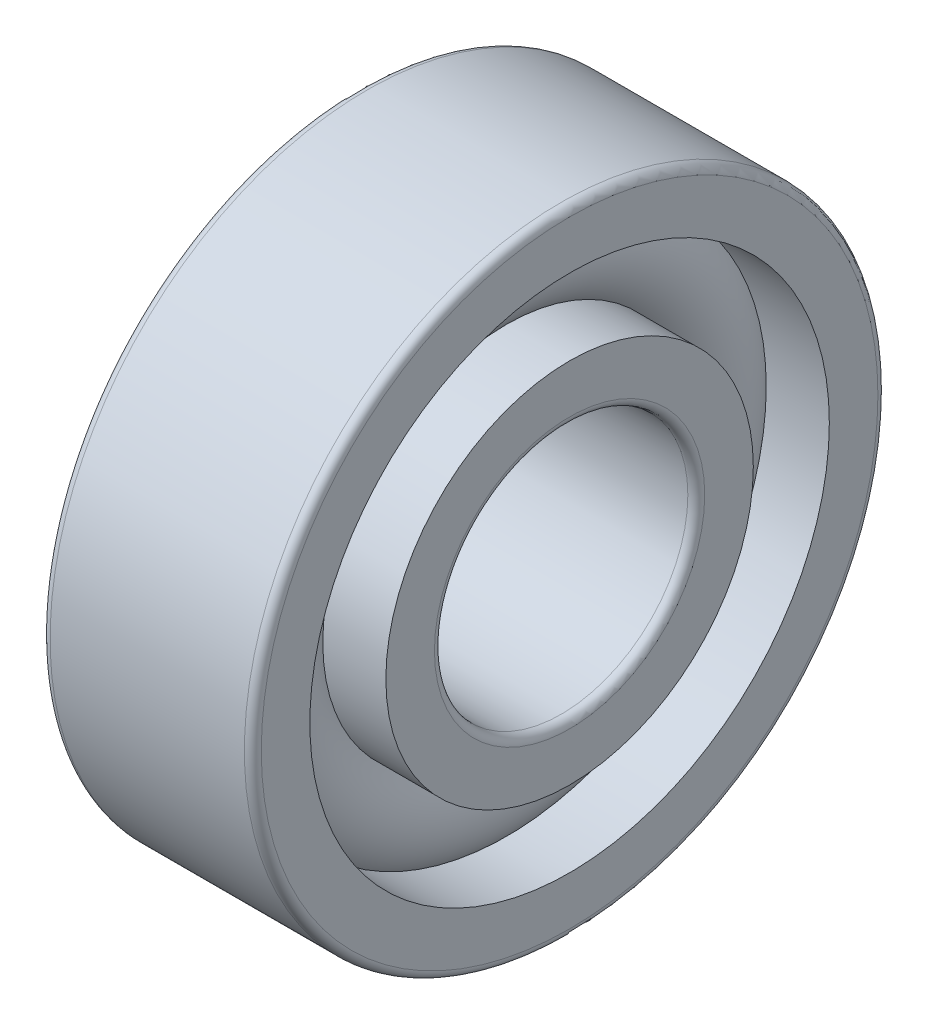
ISO-10303-21;
HEADER;
FILE_DESCRIPTION(('STEP AP214'),'2;1');
FILE_NAME('part.step','',(''),(''),'','','');
FILE_SCHEMA(('AUTOMOTIVE_DESIGN { 1 0 10303 214 1 1 1 1 }'));
ENDSEC;
DATA;
#1=APPLICATION_CONTEXT('core data for automotive mechanical design processes');
#2=APPLICATION_PROTOCOL_DEFINITION('international standard','automotive_design',2000,#1);
#3=PRODUCT_CONTEXT('',#1,'mechanical');
#4=PRODUCT('Part','Part','',(#3));
#5=PRODUCT_RELATED_PRODUCT_CATEGORY('part','',(#4));
#6=PRODUCT_DEFINITION_FORMATION('','',#4);
#7=PRODUCT_DEFINITION_CONTEXT('part definition',#1,'design');
#8=PRODUCT_DEFINITION('design','',#6,#7);
#9=PRODUCT_DEFINITION_SHAPE('','',#8);
#10=(LENGTH_UNIT() NAMED_UNIT(*) SI_UNIT(.MILLI.,.METRE.));
#11=(NAMED_UNIT(*) PLANE_ANGLE_UNIT() SI_UNIT($,.RADIAN.));
#12=(NAMED_UNIT(*) SI_UNIT($,.STERADIAN.) SOLID_ANGLE_UNIT());
#13=UNCERTAINTY_MEASURE_WITH_UNIT(LENGTH_MEASURE(1.E-05),#10,'distance_accuracy_value','');
#14=(GEOMETRIC_REPRESENTATION_CONTEXT(3) GLOBAL_UNCERTAINTY_ASSIGNED_CONTEXT((#13)) GLOBAL_UNIT_ASSIGNED_CONTEXT((#10,
#11,#12)) REPRESENTATION_CONTEXT('',''));
#15=CARTESIAN_POINT('',(0.,0.,0.));
#16=DIRECTION('',(0.,0.,1.));
#17=DIRECTION('',(1.,0.,0.));
#18=AXIS2_PLACEMENT_3D('',#15,#16,#17);
#19=CARTESIAN_POINT('',(0.,0.,0.));
#20=DIRECTION('',(-1.,0.,0.));
#21=DIRECTION('',(0.,0.,1.));
#22=AXIS2_PLACEMENT_3D('',#19,#20,#21);
#23=TOROIDAL_SURFACE('',#22,5.25,1.35);
#24=CARTESIAN_POINT('',(1.0062305898749,0.,0.));
#25=DIRECTION('',(-1.,0.,0.));
#26=DIRECTION('',(0.,0.,1.));
#27=AXIS2_PLACEMENT_3D('',#24,#25,#26);
#28=CIRCLE('',#27,6.15000000000001);
#29=CARTESIAN_POINT('',(1.0062305898749,0.,6.15000000000001));
#30=VERTEX_POINT('',#29);
#31=EDGE_CURVE('E34',#30,#30,#28,.F.);
#32=ORIENTED_EDGE('',*,*,#31,.T.);
#33=EDGE_LOOP('',(#32));
#34=FACE_BOUND('',#33,.T.);
#35=CARTESIAN_POINT('',(1.0062305898749,0.,0.));
#36=DIRECTION('',(-1.,0.,0.));
#37=DIRECTION('',(0.,0.,1.));
#38=AXIS2_PLACEMENT_3D('',#35,#36,#37);
#39=CIRCLE('',#38,4.35);
#40=CARTESIAN_POINT('',(1.0062305898749,0.,4.35));
#41=VERTEX_POINT('',#40);
#42=EDGE_CURVE('E10',#41,#41,#39,.T.);
#43=ORIENTED_EDGE('',*,*,#42,.T.);
#44=EDGE_LOOP('',(#43));
#45=FACE_BOUND('',#44,.T.);
#46=ADVANCED_FACE('F30',(#34,#45),#23,.T.);
#47=CARTESIAN_POINT('',(-20.6375,0.,0.));
#48=DIRECTION('',(1.,0.,0.));
#49=DIRECTION('',(0.,0.,-1.));
#50=AXIS2_PLACEMENT_3D('',#47,#48,#49);
#51=CYLINDRICAL_SURFACE('',#50,4.35);
#52=CARTESIAN_POINT('',(2.5,0.,0.));
#53=DIRECTION('',(1.,0.,0.));
#54=DIRECTION('',(0.,0.,-1.));
#55=AXIS2_PLACEMENT_3D('',#52,#53,#54);
#56=CIRCLE('',#55,4.35);
#57=CARTESIAN_POINT('',(2.5,0.,-4.35));
#58=VERTEX_POINT('',#57);
#59=EDGE_CURVE('E43',#58,#58,#56,.T.);
#60=ORIENTED_EDGE('',*,*,#59,.F.);
#61=EDGE_LOOP('',(#60));
#62=FACE_BOUND('',#61,.T.);
#63=ORIENTED_EDGE('',*,*,#42,.F.);
#64=EDGE_LOOP('',(#63));
#65=FACE_BOUND('',#64,.T.);
#66=ADVANCED_FACE('F82',(#62,#65),#51,.T.);
#67=CARTESIAN_POINT('',(-20.6375,0.,0.));
#68=DIRECTION('',(1.,0.,0.));
#69=DIRECTION('',(0.,0.,-1.));
#70=AXIS2_PLACEMENT_3D('',#67,#68,#69);
#71=CYLINDRICAL_SURFACE('',#70,4.35);
#72=CARTESIAN_POINT('',(-2.5,0.,0.));
#73=DIRECTION('',(1.,0.,0.));
#74=DIRECTION('',(0.,0.,-1.));
#75=AXIS2_PLACEMENT_3D('',#72,#73,#74);
#76=CIRCLE('',#75,4.35);
#77=CARTESIAN_POINT('',(-2.5,0.,-4.35));
#78=VERTEX_POINT('',#77);
#79=EDGE_CURVE('E52',#78,#78,#76,.T.);
#80=ORIENTED_EDGE('',*,*,#79,.T.);
#81=EDGE_LOOP('',(#80));
#82=FACE_BOUND('',#81,.T.);
#83=CARTESIAN_POINT('',(-1.0062305898749,0.,0.));
#84=DIRECTION('',(1.,0.,0.));
#85=DIRECTION('',(0.,0.,-1.));
#86=AXIS2_PLACEMENT_3D('',#83,#84,#85);
#87=CIRCLE('',#86,4.35);
#88=CARTESIAN_POINT('',(-1.0062305898749,0.,-4.35));
#89=VERTEX_POINT('',#88);
#90=EDGE_CURVE('E38',#89,#89,#87,.T.);
#91=ORIENTED_EDGE('',*,*,#90,.F.);
#92=EDGE_LOOP('',(#91));
#93=FACE_BOUND('',#92,.T.);
#94=ADVANCED_FACE('F85',(#82,#93),#71,.T.);
#95=CARTESIAN_POINT('',(2.5,3.2,0.));
#96=DIRECTION('',(1.,0.,0.));
#97=DIRECTION('',(0.,0.,-1.));
#98=AXIS2_PLACEMENT_3D('',#95,#96,#97);
#99=PLANE('',#98);
#100=ORIENTED_EDGE('',*,*,#59,.T.);
#101=EDGE_LOOP('',(#100));
#102=FACE_BOUND('',#101,.T.);
#103=CARTESIAN_POINT('',(2.5,0.,0.));
#104=DIRECTION('',(1.,0.,0.));
#105=DIRECTION('',(0.,0.,-1.));
#106=AXIS2_PLACEMENT_3D('',#103,#104,#105);
#107=CIRCLE('',#106,3.2);
#108=CARTESIAN_POINT('',(2.5,0.,-3.2));
#109=VERTEX_POINT('',#108);
#110=EDGE_CURVE('E74',#109,#109,#107,.T.);
#111=ORIENTED_EDGE('',*,*,#110,.F.);
#112=EDGE_LOOP('',(#111));
#113=FACE_BOUND('',#112,.T.);
#114=ADVANCED_FACE('F79',(#102,#113),#99,.T.);
#115=CARTESIAN_POINT('',(2.3,0.,0.));
#116=DIRECTION('',(1.,0.,0.));
#117=DIRECTION('',(0.,0.,-1.));
#118=AXIS2_PLACEMENT_3D('',#115,#116,#117);
#119=TOROIDAL_SURFACE('',#118,3.2,0.2);
#120=ORIENTED_EDGE('',*,*,#110,.T.);
#121=EDGE_LOOP('',(#120));
#122=FACE_BOUND('',#121,.T.);
#123=CARTESIAN_POINT('',(2.3,0.,0.));
#124=DIRECTION('',(1.,0.,0.));
#125=DIRECTION('',(0.,0.,-1.));
#126=AXIS2_PLACEMENT_3D('',#123,#124,#125);
#127=CIRCLE('',#126,3.);
#128=CARTESIAN_POINT('',(2.3,0.,-3.));
#129=VERTEX_POINT('',#128);
#130=EDGE_CURVE('E71',#129,#129,#127,.T.);
#131=ORIENTED_EDGE('',*,*,#130,.F.);
#132=EDGE_LOOP('',(#131));
#133=FACE_BOUND('',#132,.T.);
#134=ADVANCED_FACE('F96',(#122,#133),#119,.T.);
#135=CARTESIAN_POINT('',(-20.6375,0.,0.));
#136=DIRECTION('',(1.,0.,0.));
#137=DIRECTION('',(0.,0.,-1.));
#138=AXIS2_PLACEMENT_3D('',#135,#136,#137);
#139=CYLINDRICAL_SURFACE('',#138,3.);
#140=ORIENTED_EDGE('',*,*,#130,.T.);
#141=EDGE_LOOP('',(#140));
#142=FACE_BOUND('',#141,.T.);
#143=CARTESIAN_POINT('',(-2.3,0.,0.));
#144=DIRECTION('',(1.,0.,0.));
#145=DIRECTION('',(0.,0.,-1.));
#146=AXIS2_PLACEMENT_3D('',#143,#144,#145);
#147=CIRCLE('',#146,3.);
#148=CARTESIAN_POINT('',(-2.3,0.,-3.));
#149=VERTEX_POINT('',#148);
#150=EDGE_CURVE('E68',#149,#149,#147,.T.);
#151=ORIENTED_EDGE('',*,*,#150,.F.);
#152=EDGE_LOOP('',(#151));
#153=FACE_BOUND('',#152,.T.);
#154=ADVANCED_FACE('F99',(#142,#153),#139,.F.);
#155=CARTESIAN_POINT('',(-2.3,0.,0.));
#156=DIRECTION('',(1.,0.,0.));
#157=DIRECTION('',(0.,0.,-1.));
#158=AXIS2_PLACEMENT_3D('',#155,#156,#157);
#159=TOROIDAL_SURFACE('',#158,3.2,0.2);
#160=ORIENTED_EDGE('',*,*,#150,.T.);
#161=EDGE_LOOP('',(#160));
#162=FACE_BOUND('',#161,.T.);
#163=CARTESIAN_POINT('',(-2.5,0.,0.));
#164=DIRECTION('',(1.,0.,0.));
#165=DIRECTION('',(0.,0.,-1.));
#166=AXIS2_PLACEMENT_3D('',#163,#164,#165);
#167=CIRCLE('',#166,3.2);
#168=CARTESIAN_POINT('',(-2.5,0.,-3.2));
#169=VERTEX_POINT('',#168);
#170=EDGE_CURVE('E65',#169,#169,#167,.T.);
#171=ORIENTED_EDGE('',*,*,#170,.F.);
#172=EDGE_LOOP('',(#171));
#173=FACE_BOUND('',#172,.T.);
#174=ADVANCED_FACE('F103',(#162,#173),#159,.T.);
#175=CARTESIAN_POINT('',(-2.5,4.35,0.));
#176=DIRECTION('',(-1.,0.,0.));
#177=DIRECTION('',(0.,0.,1.));
#178=AXIS2_PLACEMENT_3D('',#175,#176,#177);
#179=PLANE('',#178);
#180=ORIENTED_EDGE('',*,*,#170,.T.);
#181=EDGE_LOOP('',(#180));
#182=FACE_BOUND('',#181,.T.);
#183=ORIENTED_EDGE('',*,*,#79,.F.);
#184=EDGE_LOOP('',(#183));
#185=FACE_BOUND('',#184,.T.);
#186=ADVANCED_FACE('F107',(#182,#185),#179,.T.);
#187=CARTESIAN_POINT('',(-1.0062305898749,0.,0.));
#188=DIRECTION('',(1.,0.,0.));
#189=DIRECTION('',(0.,0.,-1.));
#190=AXIS2_PLACEMENT_3D('',#187,#188,#189);
#191=CIRCLE('',#190,6.15000000000001);
#192=CARTESIAN_POINT('',(-1.0062305898749,0.,-6.15000000000001));
#193=VERTEX_POINT('',#192);
#194=EDGE_CURVE('E46',#193,#193,#191,.F.);
#195=ORIENTED_EDGE('',*,*,#194,.T.);
#196=EDGE_LOOP('',(#195));
#197=FACE_BOUND('',#196,.T.);
#198=ORIENTED_EDGE('',*,*,#90,.T.);
#199=EDGE_LOOP('',(#198));
#200=FACE_BOUND('',#199,.T.);
#201=ADVANCED_FACE('F32',(#197,#200),#23,.T.);
#202=CARTESIAN_POINT('',(-20.6375,0.,0.));
#203=DIRECTION('',(1.,0.,0.));
#204=DIRECTION('',(0.,0.,-1.));
#205=AXIS2_PLACEMENT_3D('',#202,#203,#204);
#206=CYLINDRICAL_SURFACE('',#205,6.15000000000001);
#207=CARTESIAN_POINT('',(2.5,0.,0.));
#208=DIRECTION('',(1.,0.,0.));
#209=DIRECTION('',(0.,0.,-1.));
#210=AXIS2_PLACEMENT_3D('',#207,#208,#209);
#211=CIRCLE('',#210,6.15000000000001);
#212=CARTESIAN_POINT('',(2.5,0.,-6.15000000000001));
#213=VERTEX_POINT('',#212);
#214=EDGE_CURVE('E48',#213,#213,#211,.T.);
#215=ORIENTED_EDGE('',*,*,#214,.T.);
#216=EDGE_LOOP('',(#215));
#217=FACE_BOUND('',#216,.T.);
#218=ORIENTED_EDGE('',*,*,#31,.F.);
#219=EDGE_LOOP('',(#218));
#220=FACE_BOUND('',#219,.T.);
#221=ADVANCED_FACE('F112',(#217,#220),#206,.F.);
#222=CARTESIAN_POINT('',(-20.6375,0.,0.));
#223=DIRECTION('',(1.,0.,0.));
#224=DIRECTION('',(0.,0.,-1.));
#225=AXIS2_PLACEMENT_3D('',#222,#223,#224);
#226=CYLINDRICAL_SURFACE('',#225,6.15000000000001);
#227=CARTESIAN_POINT('',(-2.5,0.,0.));
#228=DIRECTION('',(1.,0.,0.));
#229=DIRECTION('',(0.,0.,-1.));
#230=AXIS2_PLACEMENT_3D('',#227,#228,#229);
#231=CIRCLE('',#230,6.15000000000001);
#232=CARTESIAN_POINT('',(-2.5,0.,-6.15000000000001));
#233=VERTEX_POINT('',#232);
#234=EDGE_CURVE('E143',#233,#233,#231,.T.);
#235=ORIENTED_EDGE('',*,*,#234,.F.);
#236=EDGE_LOOP('',(#235));
#237=FACE_BOUND('',#236,.T.);
#238=ORIENTED_EDGE('',*,*,#194,.F.);
#239=EDGE_LOOP('',(#238));
#240=FACE_BOUND('',#239,.T.);
#241=ADVANCED_FACE('F115',(#237,#240),#226,.F.);
#242=CARTESIAN_POINT('',(2.5,7.30000000000001,0.));
#243=DIRECTION('',(1.,0.,0.));
#244=DIRECTION('',(0.,0.,-1.));
#245=AXIS2_PLACEMENT_3D('',#242,#243,#244);
#246=PLANE('',#245);
#247=CARTESIAN_POINT('',(2.5,0.,0.));
#248=DIRECTION('',(1.,0.,0.));
#249=DIRECTION('',(0.,0.,-1.));
#250=AXIS2_PLACEMENT_3D('',#247,#248,#249);
#251=CIRCLE('',#250,7.30000000000001);
#252=CARTESIAN_POINT('',(2.5,0.,-7.30000000000001));
#253=VERTEX_POINT('',#252);
#254=EDGE_CURVE('E54',#253,#253,#251,.T.);
#255=ORIENTED_EDGE('',*,*,#254,.T.);
#256=EDGE_LOOP('',(#255));
#257=FACE_BOUND('',#256,.T.);
#258=ORIENTED_EDGE('',*,*,#214,.F.);
#259=EDGE_LOOP('',(#258));
#260=FACE_BOUND('',#259,.T.);
#261=ADVANCED_FACE('F116',(#257,#260),#246,.T.);
#262=CARTESIAN_POINT('',(2.3,0.,0.));
#263=DIRECTION('',(1.,0.,0.));
#264=DIRECTION('',(0.,0.,-1.));
#265=AXIS2_PLACEMENT_3D('',#262,#263,#264);
#266=TOROIDAL_SURFACE('',#265,7.30000000000001,0.200000000000001);
#267=CARTESIAN_POINT('',(2.3,0.,0.));
#268=DIRECTION('',(1.,0.,0.));
#269=DIRECTION('',(0.,0.,-1.));
#270=AXIS2_PLACEMENT_3D('',#267,#268,#269);
#271=CIRCLE('',#270,7.50000000000001);
#272=CARTESIAN_POINT('',(2.3,0.,-7.50000000000001));
#273=VERTEX_POINT('',#272);
#274=EDGE_CURVE('E59',#273,#273,#271,.T.);
#275=ORIENTED_EDGE('',*,*,#274,.T.);
#276=EDGE_LOOP('',(#275));
#277=FACE_BOUND('',#276,.T.);
#278=ORIENTED_EDGE('',*,*,#254,.F.);
#279=EDGE_LOOP('',(#278));
#280=FACE_BOUND('',#279,.T.);
#281=ADVANCED_FACE('F119',(#277,#280),#266,.T.);
#282=CARTESIAN_POINT('',(-20.6375,0.,0.));
#283=DIRECTION('',(1.,0.,0.));
#284=DIRECTION('',(0.,0.,-1.));
#285=AXIS2_PLACEMENT_3D('',#282,#283,#284);
#286=CYLINDRICAL_SURFACE('',#285,7.50000000000001);
#287=CARTESIAN_POINT('',(-2.3,0.,0.));
#288=DIRECTION('',(1.,0.,0.));
#289=DIRECTION('',(0.,0.,-1.));
#290=AXIS2_PLACEMENT_3D('',#287,#288,#289);
#291=CIRCLE('',#290,7.50000000000001);
#292=CARTESIAN_POINT('',(-2.3,0.,-7.50000000000001));
#293=VERTEX_POINT('',#292);
#294=EDGE_CURVE('E147',#293,#293,#291,.T.);
#295=ORIENTED_EDGE('',*,*,#294,.T.);
#296=EDGE_LOOP('',(#295));
#297=FACE_BOUND('',#296,.T.);
#298=ORIENTED_EDGE('',*,*,#274,.F.);
#299=EDGE_LOOP('',(#298));
#300=FACE_BOUND('',#299,.T.);
#301=ADVANCED_FACE('F123',(#297,#300),#286,.T.);
#302=CARTESIAN_POINT('',(-2.3,0.,0.));
#303=DIRECTION('',(1.,0.,0.));
#304=DIRECTION('',(0.,0.,-1.));
#305=AXIS2_PLACEMENT_3D('',#302,#303,#304);
#306=TOROIDAL_SURFACE('',#305,7.30000000000001,0.200000000000001);
#307=CARTESIAN_POINT('',(-2.5,0.,0.));
#308=DIRECTION('',(1.,0.,0.));
#309=DIRECTION('',(0.,0.,-1.));
#310=AXIS2_PLACEMENT_3D('',#307,#308,#309);
#311=CIRCLE('',#310,7.30000000000001);
#312=CARTESIAN_POINT('',(-2.5,0.,-7.30000000000001));
#313=VERTEX_POINT('',#312);
#314=EDGE_CURVE('E144',#313,#313,#311,.T.);
#315=ORIENTED_EDGE('',*,*,#314,.T.);
#316=EDGE_LOOP('',(#315));
#317=FACE_BOUND('',#316,.T.);
#318=ORIENTED_EDGE('',*,*,#294,.F.);
#319=EDGE_LOOP('',(#318));
#320=FACE_BOUND('',#319,.T.);
#321=ADVANCED_FACE('F127',(#317,#320),#306,.T.);
#322=CARTESIAN_POINT('',(-2.5,6.15000000000001,0.));
#323=DIRECTION('',(-1.,0.,0.));
#324=DIRECTION('',(0.,0.,1.));
#325=AXIS2_PLACEMENT_3D('',#322,#323,#324);
#326=PLANE('',#325);
#327=ORIENTED_EDGE('',*,*,#234,.T.);
#328=EDGE_LOOP('',(#327));
#329=FACE_BOUND('',#328,.T.);
#330=ORIENTED_EDGE('',*,*,#314,.F.);
#331=EDGE_LOOP('',(#330));
#332=FACE_BOUND('',#331,.T.);
#333=ADVANCED_FACE('F131',(#329,#332),#326,.T.);
#334=CLOSED_SHELL('',(#46,#66,#94,#114,#134,#154,#174,#186,#201,#221,#241,#261,#281,#301,#321,#333));
#335=MANIFOLD_SOLID_BREP('B2',#334);
#336=ADVANCED_BREP_SHAPE_REPRESENTATION('',(#18,#335),#14);
#337=SHAPE_DEFINITION_REPRESENTATION(#9,#336);
ENDSEC;
END-ISO-10303-21;
